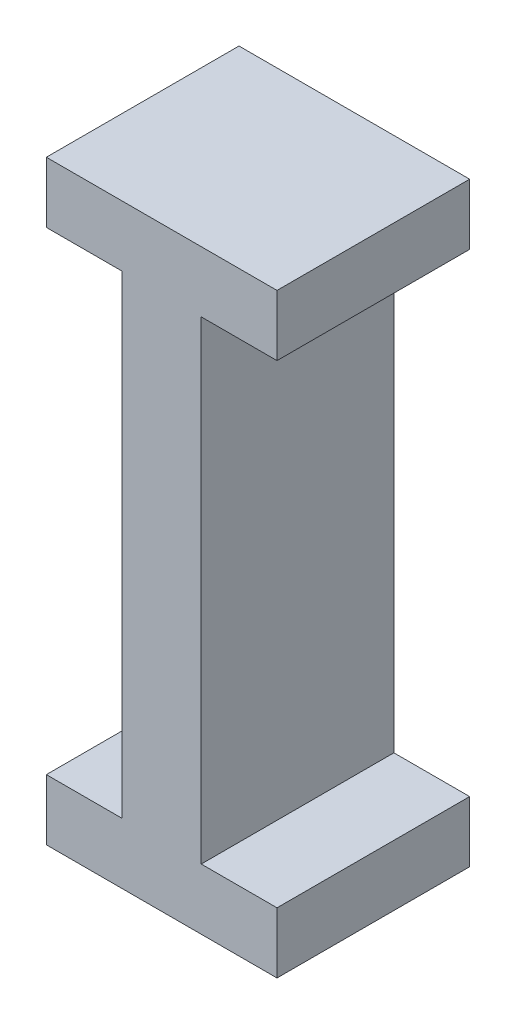
ISO-10303-21;
HEADER;
FILE_DESCRIPTION(('STEP AP214'),'2;1');
FILE_NAME('part.step','',(''),(''),'','','');
FILE_SCHEMA(('AUTOMOTIVE_DESIGN { 1 0 10303 214 1 1 1 1 }'));
ENDSEC;
DATA;
#1=APPLICATION_CONTEXT('core data for automotive mechanical design processes');
#2=APPLICATION_PROTOCOL_DEFINITION('international standard','automotive_design',2000,#1);
#3=PRODUCT_CONTEXT('',#1,'mechanical');
#4=PRODUCT('Part','Part','',(#3));
#5=PRODUCT_RELATED_PRODUCT_CATEGORY('part','',(#4));
#6=PRODUCT_DEFINITION_FORMATION('','',#4);
#7=PRODUCT_DEFINITION_CONTEXT('part definition',#1,'design');
#8=PRODUCT_DEFINITION('design','',#6,#7);
#9=PRODUCT_DEFINITION_SHAPE('','',#8);
#10=(LENGTH_UNIT() NAMED_UNIT(*) SI_UNIT(.MILLI.,.METRE.));
#11=(NAMED_UNIT(*) PLANE_ANGLE_UNIT() SI_UNIT($,.RADIAN.));
#12=(NAMED_UNIT(*) SI_UNIT($,.STERADIAN.) SOLID_ANGLE_UNIT());
#13=UNCERTAINTY_MEASURE_WITH_UNIT(LENGTH_MEASURE(1.E-05),#10,'distance_accuracy_value','');
#14=(GEOMETRIC_REPRESENTATION_CONTEXT(3) GLOBAL_UNCERTAINTY_ASSIGNED_CONTEXT((#13)) GLOBAL_UNIT_ASSIGNED_CONTEXT((#10,
#11,#12)) REPRESENTATION_CONTEXT('',''));
#15=CARTESIAN_POINT('',(0.,0.,0.));
#16=DIRECTION('',(0.,0.,1.));
#17=DIRECTION('',(1.,0.,0.));
#18=AXIS2_PLACEMENT_3D('',#15,#16,#17);
#19=CARTESIAN_POINT('',(-1.014865503557,-2.910145048967,0.));
#20=DIRECTION('',(-1.,0.,0.));
#21=DIRECTION('',(0.,-1.,0.));
#22=AXIS2_PLACEMENT_3D('',#19,#20,#21);
#23=PLANE('',#22);
#24=DIRECTION('',(0.,1.,0.));
#25=VECTOR('',#24,1.);
#26=CARTESIAN_POINT('',(-1.014865503557,-2.941706644287,0.));
#27=LINE('',#26,#25);
#28=CARTESIAN_POINT('',(-1.014865503557,-2.941706644287,0.));
#29=VERTEX_POINT('',#28);
#30=CARTESIAN_POINT('',(-1.014865503557,-2.910145048967,0.));
#31=VERTEX_POINT('',#30);
#32=EDGE_CURVE('E11',#29,#31,#27,.T.);
#33=ORIENTED_EDGE('',*,*,#32,.F.);
#34=DIRECTION('',(0.,0.,1.));
#35=VECTOR('',#34,1.);
#36=CARTESIAN_POINT('',(-1.014865503557,-2.941706644287,0.));
#37=LINE('',#36,#35);
#38=CARTESIAN_POINT('',(-1.014865503557,-2.941706644287,0.1));
#39=VERTEX_POINT('',#38);
#40=EDGE_CURVE('E24',#29,#39,#37,.T.);
#41=ORIENTED_EDGE('',*,*,#40,.T.);
#42=DIRECTION('',(0.,-1.,0.));
#43=VECTOR('',#42,1.);
#44=CARTESIAN_POINT('',(-1.014865503557,-2.941706644287,0.1));
#45=LINE('',#44,#43);
#46=CARTESIAN_POINT('',(-1.014865503557,-2.910145048967,0.1));
#47=VERTEX_POINT('',#46);
#48=EDGE_CURVE('E124',#47,#39,#45,.T.);
#49=ORIENTED_EDGE('',*,*,#48,.F.);
#50=DIRECTION('',(0.,0.,1.));
#51=VECTOR('',#50,1.);
#52=CARTESIAN_POINT('',(-1.014865503557,-2.910145048967,0.));
#53=LINE('',#52,#51);
#54=EDGE_CURVE('E197',#31,#47,#53,.T.);
#55=ORIENTED_EDGE('',*,*,#54,.F.);
#56=EDGE_LOOP('',(#33,#41,#49,#55));
#57=FACE_BOUND('',#56,.T.);
#58=ADVANCED_FACE('F17',(#57),#23,.T.);
#59=CARTESIAN_POINT('',(-0.975538753832608,-2.910145048967,0.));
#60=DIRECTION('',(0.,1.,0.));
#61=DIRECTION('',(-1.,0.,0.));
#62=AXIS2_PLACEMENT_3D('',#59,#60,#61);
#63=PLANE('',#62);
#64=DIRECTION('',(1.,0.,0.));
#65=VECTOR('',#64,1.);
#66=CARTESIAN_POINT('',(-1.014865503557,-2.910145048967,0.));
#67=LINE('',#66,#65);
#68=CARTESIAN_POINT('',(-0.975538753832608,-2.910145048967,0.));
#69=VERTEX_POINT('',#68);
#70=EDGE_CURVE('E195',#31,#69,#67,.T.);
#71=ORIENTED_EDGE('',*,*,#70,.F.);
#72=ORIENTED_EDGE('',*,*,#54,.T.);
#73=DIRECTION('',(-1.,0.,0.));
#74=VECTOR('',#73,1.);
#75=CARTESIAN_POINT('',(-1.014865503557,-2.910145048967,0.1));
#76=LINE('',#75,#74);
#77=CARTESIAN_POINT('',(-0.975538753832608,-2.910145048967,0.1));
#78=VERTEX_POINT('',#77);
#79=EDGE_CURVE('E193',#78,#47,#76,.T.);
#80=ORIENTED_EDGE('',*,*,#79,.F.);
#81=DIRECTION('',(0.,0.,1.));
#82=VECTOR('',#81,1.);
#83=CARTESIAN_POINT('',(-0.975538753832608,-2.910145048967,0.));
#84=LINE('',#83,#82);
#85=EDGE_CURVE('E190',#69,#78,#84,.T.);
#86=ORIENTED_EDGE('',*,*,#85,.F.);
#87=EDGE_LOOP('',(#71,#72,#80,#86));
#88=FACE_BOUND('',#87,.T.);
#89=ADVANCED_FACE('F235',(#88),#63,.T.);
#90=CARTESIAN_POINT('',(-0.975538753832608,-2.664164996554,0.));
#91=DIRECTION('',(-1.,0.,0.));
#92=DIRECTION('',(0.,-1.,0.));
#93=AXIS2_PLACEMENT_3D('',#90,#91,#92);
#94=PLANE('',#93);
#95=DIRECTION('',(0.,1.,0.));
#96=VECTOR('',#95,1.);
#97=CARTESIAN_POINT('',(-0.975538753832608,-2.910145048967,0.));
#98=LINE('',#97,#96);
#99=CARTESIAN_POINT('',(-0.975538753832608,-2.664164996554,0.));
#100=VERTEX_POINT('',#99);
#101=EDGE_CURVE('E188',#69,#100,#98,.T.);
#102=ORIENTED_EDGE('',*,*,#101,.F.);
#103=ORIENTED_EDGE('',*,*,#85,.T.);
#104=DIRECTION('',(0.,-1.,0.));
#105=VECTOR('',#104,1.);
#106=CARTESIAN_POINT('',(-0.975538753832608,-2.910145048967,0.1));
#107=LINE('',#106,#105);
#108=CARTESIAN_POINT('',(-0.975538753832608,-2.664164996554,0.1));
#109=VERTEX_POINT('',#108);
#110=EDGE_CURVE('E185',#109,#78,#107,.T.);
#111=ORIENTED_EDGE('',*,*,#110,.F.);
#112=DIRECTION('',(0.,0.,1.));
#113=VECTOR('',#112,1.);
#114=CARTESIAN_POINT('',(-0.975538753832608,-2.664164996554,0.));
#115=LINE('',#114,#113);
#116=EDGE_CURVE('E182',#100,#109,#115,.T.);
#117=ORIENTED_EDGE('',*,*,#116,.F.);
#118=EDGE_LOOP('',(#102,#103,#111,#117));
#119=FACE_BOUND('',#118,.T.);
#120=ADVANCED_FACE('F231',(#119),#94,.T.);
#121=CARTESIAN_POINT('',(-1.014865503557,-2.664164996554,0.));
#122=DIRECTION('',(0.,-1.,0.));
#123=DIRECTION('',(1.,0.,0.));
#124=AXIS2_PLACEMENT_3D('',#121,#122,#123);
#125=PLANE('',#124);
#126=DIRECTION('',(-1.,0.,0.));
#127=VECTOR('',#126,1.);
#128=CARTESIAN_POINT('',(-0.975538753832608,-2.664164996554,0.));
#129=LINE('',#128,#127);
#130=CARTESIAN_POINT('',(-1.014865503557,-2.664164996554,0.));
#131=VERTEX_POINT('',#130);
#132=EDGE_CURVE('E180',#100,#131,#129,.T.);
#133=ORIENTED_EDGE('',*,*,#132,.F.);
#134=ORIENTED_EDGE('',*,*,#116,.T.);
#135=DIRECTION('',(1.,0.,0.));
#136=VECTOR('',#135,1.);
#137=CARTESIAN_POINT('',(-0.975538753832608,-2.664164996554,0.1));
#138=LINE('',#137,#136);
#139=CARTESIAN_POINT('',(-1.014865503557,-2.664164996554,0.1));
#140=VERTEX_POINT('',#139);
#141=EDGE_CURVE('E177',#140,#109,#138,.T.);
#142=ORIENTED_EDGE('',*,*,#141,.F.);
#143=DIRECTION('',(0.,0.,1.));
#144=VECTOR('',#143,1.);
#145=CARTESIAN_POINT('',(-1.014865503557,-2.664164996554,0.));
#146=LINE('',#145,#144);
#147=EDGE_CURVE('E174',#131,#140,#146,.T.);
#148=ORIENTED_EDGE('',*,*,#147,.F.);
#149=EDGE_LOOP('',(#133,#134,#142,#148));
#150=FACE_BOUND('',#149,.T.);
#151=ADVANCED_FACE('F227',(#150),#125,.T.);
#152=CARTESIAN_POINT('',(-1.014865503557,-2.632603401234,0.));
#153=DIRECTION('',(-1.,0.,0.));
#154=DIRECTION('',(0.,-1.,0.));
#155=AXIS2_PLACEMENT_3D('',#152,#153,#154);
#156=PLANE('',#155);
#157=DIRECTION('',(0.,1.,0.));
#158=VECTOR('',#157,1.);
#159=CARTESIAN_POINT('',(-1.014865503557,-2.664164996554,0.));
#160=LINE('',#159,#158);
#161=CARTESIAN_POINT('',(-1.014865503557,-2.632603401234,0.));
#162=VERTEX_POINT('',#161);
#163=EDGE_CURVE('E172',#131,#162,#160,.T.);
#164=ORIENTED_EDGE('',*,*,#163,.F.);
#165=ORIENTED_EDGE('',*,*,#147,.T.);
#166=DIRECTION('',(0.,-1.,0.));
#167=VECTOR('',#166,1.);
#168=CARTESIAN_POINT('',(-1.014865503557,-2.664164996554,0.1));
#169=LINE('',#168,#167);
#170=CARTESIAN_POINT('',(-1.014865503557,-2.632603401234,0.1));
#171=VERTEX_POINT('',#170);
#172=EDGE_CURVE('E169',#171,#140,#169,.T.);
#173=ORIENTED_EDGE('',*,*,#172,.F.);
#174=DIRECTION('',(0.,0.,1.));
#175=VECTOR('',#174,1.);
#176=CARTESIAN_POINT('',(-1.014865503557,-2.632603401234,0.));
#177=LINE('',#176,#175);
#178=EDGE_CURVE('E166',#162,#171,#177,.T.);
#179=ORIENTED_EDGE('',*,*,#178,.F.);
#180=EDGE_LOOP('',(#164,#165,#173,#179));
#181=FACE_BOUND('',#180,.T.);
#182=ADVANCED_FACE('F223',(#181),#156,.T.);
#183=CARTESIAN_POINT('',(-0.895131832422559,-2.632603401234,0.));
#184=DIRECTION('',(0.,1.,0.));
#185=DIRECTION('',(-1.,0.,0.));
#186=AXIS2_PLACEMENT_3D('',#183,#184,#185);
#187=PLANE('',#186);
#188=DIRECTION('',(1.,0.,0.));
#189=VECTOR('',#188,1.);
#190=CARTESIAN_POINT('',(-1.014865503557,-2.632603401234,0.));
#191=LINE('',#190,#189);
#192=CARTESIAN_POINT('',(-0.895131832422559,-2.632603401234,0.));
#193=VERTEX_POINT('',#192);
#194=EDGE_CURVE('E164',#162,#193,#191,.T.);
#195=ORIENTED_EDGE('',*,*,#194,.F.);
#196=ORIENTED_EDGE('',*,*,#178,.T.);
#197=DIRECTION('',(-1.,0.,0.));
#198=VECTOR('',#197,1.);
#199=CARTESIAN_POINT('',(-1.014865503557,-2.632603401234,0.1));
#200=LINE('',#199,#198);
#201=CARTESIAN_POINT('',(-0.895131832422559,-2.632603401234,0.1));
#202=VERTEX_POINT('',#201);
#203=EDGE_CURVE('E161',#202,#171,#200,.T.);
#204=ORIENTED_EDGE('',*,*,#203,.F.);
#205=DIRECTION('',(0.,0.,1.));
#206=VECTOR('',#205,1.);
#207=CARTESIAN_POINT('',(-0.895131832422559,-2.632603401234,0.));
#208=LINE('',#207,#206);
#209=EDGE_CURVE('E158',#193,#202,#208,.T.);
#210=ORIENTED_EDGE('',*,*,#209,.F.);
#211=EDGE_LOOP('',(#195,#196,#204,#210));
#212=FACE_BOUND('',#211,.T.);
#213=ADVANCED_FACE('F219',(#212),#187,.T.);
#214=CARTESIAN_POINT('',(-0.895131832422559,-2.664164996554,0.));
#215=DIRECTION('',(1.,0.,0.));
#216=DIRECTION('',(0.,1.,0.));
#217=AXIS2_PLACEMENT_3D('',#214,#215,#216);
#218=PLANE('',#217);
#219=DIRECTION('',(0.,-1.,0.));
#220=VECTOR('',#219,1.);
#221=CARTESIAN_POINT('',(-0.895131832422559,-2.632603401234,0.));
#222=LINE('',#221,#220);
#223=CARTESIAN_POINT('',(-0.895131832422559,-2.664164996554,0.));
#224=VERTEX_POINT('',#223);
#225=EDGE_CURVE('E156',#193,#224,#222,.T.);
#226=ORIENTED_EDGE('',*,*,#225,.F.);
#227=ORIENTED_EDGE('',*,*,#209,.T.);
#228=DIRECTION('',(0.,1.,0.));
#229=VECTOR('',#228,1.);
#230=CARTESIAN_POINT('',(-0.895131832422559,-2.632603401234,0.1));
#231=LINE('',#230,#229);
#232=CARTESIAN_POINT('',(-0.895131832422559,-2.664164996554,0.1));
#233=VERTEX_POINT('',#232);
#234=EDGE_CURVE('E153',#233,#202,#231,.T.);
#235=ORIENTED_EDGE('',*,*,#234,.F.);
#236=DIRECTION('',(0.,0.,1.));
#237=VECTOR('',#236,1.);
#238=CARTESIAN_POINT('',(-0.895131832422559,-2.664164996554,0.));
#239=LINE('',#238,#237);
#240=EDGE_CURVE('E150',#224,#233,#239,.T.);
#241=ORIENTED_EDGE('',*,*,#240,.F.);
#242=EDGE_LOOP('',(#226,#227,#235,#241));
#243=FACE_BOUND('',#242,.T.);
#244=ADVANCED_FACE('F215',(#243),#218,.T.);
#245=CARTESIAN_POINT('',(-0.934458582146477,-2.664164996554,0.));
#246=DIRECTION('',(0.,-1.,0.));
#247=DIRECTION('',(1.,0.,0.));
#248=AXIS2_PLACEMENT_3D('',#245,#246,#247);
#249=PLANE('',#248);
#250=DIRECTION('',(-1.,0.,0.));
#251=VECTOR('',#250,1.);
#252=CARTESIAN_POINT('',(-0.895131832422559,-2.664164996554,0.));
#253=LINE('',#252,#251);
#254=CARTESIAN_POINT('',(-0.934458582146477,-2.664164996554,0.));
#255=VERTEX_POINT('',#254);
#256=EDGE_CURVE('E148',#224,#255,#253,.T.);
#257=ORIENTED_EDGE('',*,*,#256,.F.);
#258=ORIENTED_EDGE('',*,*,#240,.T.);
#259=DIRECTION('',(1.,0.,0.));
#260=VECTOR('',#259,1.);
#261=CARTESIAN_POINT('',(-0.895131832422559,-2.664164996554,0.1));
#262=LINE('',#261,#260);
#263=CARTESIAN_POINT('',(-0.934458582146477,-2.664164996554,0.1));
#264=VERTEX_POINT('',#263);
#265=EDGE_CURVE('E145',#264,#233,#262,.T.);
#266=ORIENTED_EDGE('',*,*,#265,.F.);
#267=DIRECTION('',(0.,0.,1.));
#268=VECTOR('',#267,1.);
#269=CARTESIAN_POINT('',(-0.934458582146477,-2.664164996554,0.));
#270=LINE('',#269,#268);
#271=EDGE_CURVE('E142',#255,#264,#270,.T.);
#272=ORIENTED_EDGE('',*,*,#271,.F.);
#273=EDGE_LOOP('',(#257,#258,#266,#272));
#274=FACE_BOUND('',#273,.T.);
#275=ADVANCED_FACE('F211',(#274),#249,.T.);
#276=CARTESIAN_POINT('',(-0.934458582146477,-2.910145048967,0.));
#277=DIRECTION('',(1.,0.,0.));
#278=DIRECTION('',(0.,1.,0.));
#279=AXIS2_PLACEMENT_3D('',#276,#277,#278);
#280=PLANE('',#279);
#281=DIRECTION('',(0.,-1.,0.));
#282=VECTOR('',#281,1.);
#283=CARTESIAN_POINT('',(-0.934458582146477,-2.664164996554,0.));
#284=LINE('',#283,#282);
#285=CARTESIAN_POINT('',(-0.934458582146477,-2.910145048967,0.));
#286=VERTEX_POINT('',#285);
#287=EDGE_CURVE('E140',#255,#286,#284,.T.);
#288=ORIENTED_EDGE('',*,*,#287,.F.);
#289=ORIENTED_EDGE('',*,*,#271,.T.);
#290=DIRECTION('',(0.,1.,0.));
#291=VECTOR('',#290,1.);
#292=CARTESIAN_POINT('',(-0.934458582146477,-2.664164996554,0.1));
#293=LINE('',#292,#291);
#294=CARTESIAN_POINT('',(-0.934458582146477,-2.910145048967,0.1));
#295=VERTEX_POINT('',#294);
#296=EDGE_CURVE('E137',#295,#264,#293,.T.);
#297=ORIENTED_EDGE('',*,*,#296,.F.);
#298=DIRECTION('',(0.,0.,1.));
#299=VECTOR('',#298,1.);
#300=CARTESIAN_POINT('',(-0.934458582146477,-2.910145048967,0.));
#301=LINE('',#300,#299);
#302=EDGE_CURVE('E134',#286,#295,#301,.T.);
#303=ORIENTED_EDGE('',*,*,#302,.F.);
#304=EDGE_LOOP('',(#288,#289,#297,#303));
#305=FACE_BOUND('',#304,.T.);
#306=ADVANCED_FACE('F207',(#305),#280,.T.);
#307=CARTESIAN_POINT('',(-0.895131832422559,-2.910145048967,0.));
#308=DIRECTION('',(0.,1.,0.));
#309=DIRECTION('',(-1.,0.,0.));
#310=AXIS2_PLACEMENT_3D('',#307,#308,#309);
#311=PLANE('',#310);
#312=DIRECTION('',(1.,0.,0.));
#313=VECTOR('',#312,1.);
#314=CARTESIAN_POINT('',(-0.934458582146477,-2.910145048967,0.));
#315=LINE('',#314,#313);
#316=CARTESIAN_POINT('',(-0.895131832422559,-2.910145048967,0.));
#317=VERTEX_POINT('',#316);
#318=EDGE_CURVE('E132',#286,#317,#315,.T.);
#319=ORIENTED_EDGE('',*,*,#318,.F.);
#320=ORIENTED_EDGE('',*,*,#302,.T.);
#321=DIRECTION('',(-1.,0.,0.));
#322=VECTOR('',#321,1.);
#323=CARTESIAN_POINT('',(-0.934458582146477,-2.910145048967,0.1));
#324=LINE('',#323,#322);
#325=CARTESIAN_POINT('',(-0.895131832422559,-2.910145048967,0.1));
#326=VERTEX_POINT('',#325);
#327=EDGE_CURVE('E130',#326,#295,#324,.T.);
#328=ORIENTED_EDGE('',*,*,#327,.F.);
#329=DIRECTION('',(0.,0.,1.));
#330=VECTOR('',#329,1.);
#331=CARTESIAN_POINT('',(-0.895131832422559,-2.910145048967,0.));
#332=LINE('',#331,#330);
#333=EDGE_CURVE('E109',#317,#326,#332,.T.);
#334=ORIENTED_EDGE('',*,*,#333,.F.);
#335=EDGE_LOOP('',(#319,#320,#328,#334));
#336=FACE_BOUND('',#335,.T.);
#337=ADVANCED_FACE('F205',(#336),#311,.T.);
#338=CARTESIAN_POINT('',(-0.895131832422559,-2.941706644287,0.));
#339=DIRECTION('',(1.,0.,0.));
#340=DIRECTION('',(0.,1.,0.));
#341=AXIS2_PLACEMENT_3D('',#338,#339,#340);
#342=PLANE('',#341);
#343=DIRECTION('',(0.,-1.,0.));
#344=VECTOR('',#343,1.);
#345=CARTESIAN_POINT('',(-0.895131832422559,-2.910145048967,0.));
#346=LINE('',#345,#344);
#347=CARTESIAN_POINT('',(-0.895131832422559,-2.941706644287,0.));
#348=VERTEX_POINT('',#347);
#349=EDGE_CURVE('E113',#317,#348,#346,.T.);
#350=ORIENTED_EDGE('',*,*,#349,.F.);
#351=ORIENTED_EDGE('',*,*,#333,.T.);
#352=DIRECTION('',(0.,1.,0.));
#353=VECTOR('',#352,1.);
#354=CARTESIAN_POINT('',(-0.895131832422559,-2.910145048967,0.1));
#355=LINE('',#354,#353);
#356=CARTESIAN_POINT('',(-0.895131832422559,-2.941706644287,0.1));
#357=VERTEX_POINT('',#356);
#358=EDGE_CURVE('E102',#357,#326,#355,.T.);
#359=ORIENTED_EDGE('',*,*,#358,.F.);
#360=DIRECTION('',(0.,0.,1.));
#361=VECTOR('',#360,1.);
#362=CARTESIAN_POINT('',(-0.895131832422559,-2.941706644287,0.));
#363=LINE('',#362,#361);
#364=EDGE_CURVE('E106',#348,#357,#363,.T.);
#365=ORIENTED_EDGE('',*,*,#364,.F.);
#366=EDGE_LOOP('',(#350,#351,#359,#365));
#367=FACE_BOUND('',#366,.T.);
#368=ADVANCED_FACE('F105',(#367),#342,.T.);
#369=CARTESIAN_POINT('',(-1.014865503557,-2.941706644287,0.));
#370=DIRECTION('',(0.,-1.,0.));
#371=DIRECTION('',(1.,0.,0.));
#372=AXIS2_PLACEMENT_3D('',#369,#370,#371);
#373=PLANE('',#372);
#374=DIRECTION('',(-1.,0.,0.));
#375=VECTOR('',#374,1.);
#376=CARTESIAN_POINT('',(-0.895131832422559,-2.941706644287,0.));
#377=LINE('',#376,#375);
#378=EDGE_CURVE('E119',#348,#29,#377,.T.);
#379=ORIENTED_EDGE('',*,*,#378,.F.);
#380=ORIENTED_EDGE('',*,*,#364,.T.);
#381=DIRECTION('',(1.,0.,0.));
#382=VECTOR('',#381,1.);
#383=CARTESIAN_POINT('',(-0.895131832422559,-2.941706644287,0.1));
#384=LINE('',#383,#382);
#385=EDGE_CURVE('E118',#39,#357,#384,.T.);
#386=ORIENTED_EDGE('',*,*,#385,.F.);
#387=ORIENTED_EDGE('',*,*,#40,.F.);
#388=EDGE_LOOP('',(#379,#380,#386,#387));
#389=FACE_BOUND('',#388,.T.);
#390=ADVANCED_FACE('F117',(#389),#373,.T.);
#391=CARTESIAN_POINT('',(-0.954998667989543,-2.787155022761,0.));
#392=DIRECTION('',(0.,0.,1.));
#393=DIRECTION('',(1.,0.,0.));
#394=AXIS2_PLACEMENT_3D('',#391,#392,#393);
#395=PLANE('',#394);
#396=ORIENTED_EDGE('',*,*,#378,.T.);
#397=ORIENTED_EDGE('',*,*,#32,.T.);
#398=ORIENTED_EDGE('',*,*,#70,.T.);
#399=ORIENTED_EDGE('',*,*,#101,.T.);
#400=ORIENTED_EDGE('',*,*,#132,.T.);
#401=ORIENTED_EDGE('',*,*,#163,.T.);
#402=ORIENTED_EDGE('',*,*,#194,.T.);
#403=ORIENTED_EDGE('',*,*,#225,.T.);
#404=ORIENTED_EDGE('',*,*,#256,.T.);
#405=ORIENTED_EDGE('',*,*,#287,.T.);
#406=ORIENTED_EDGE('',*,*,#318,.T.);
#407=ORIENTED_EDGE('',*,*,#349,.T.);
#408=EDGE_LOOP('',(#396,#397,#398,#399,#400,#401,#402,#403,#404,#405,#406,#407));
#409=FACE_BOUND('',#408,.T.);
#410=ADVANCED_FACE('F200',(#409),#395,.F.);
#411=CARTESIAN_POINT('',(-0.954998667989543,-2.787155022761,0.1));
#412=DIRECTION('',(0.,0.,1.));
#413=DIRECTION('',(1.,0.,0.));
#414=AXIS2_PLACEMENT_3D('',#411,#412,#413);
#415=PLANE('',#414);
#416=ORIENTED_EDGE('',*,*,#385,.T.);
#417=ORIENTED_EDGE('',*,*,#358,.T.);
#418=ORIENTED_EDGE('',*,*,#327,.T.);
#419=ORIENTED_EDGE('',*,*,#296,.T.);
#420=ORIENTED_EDGE('',*,*,#265,.T.);
#421=ORIENTED_EDGE('',*,*,#234,.T.);
#422=ORIENTED_EDGE('',*,*,#203,.T.);
#423=ORIENTED_EDGE('',*,*,#172,.T.);
#424=ORIENTED_EDGE('',*,*,#141,.T.);
#425=ORIENTED_EDGE('',*,*,#110,.T.);
#426=ORIENTED_EDGE('',*,*,#79,.T.);
#427=ORIENTED_EDGE('',*,*,#48,.T.);
#428=EDGE_LOOP('',(#416,#417,#418,#419,#420,#421,#422,#423,#424,#425,#426,#427));
#429=FACE_BOUND('',#428,.T.);
#430=ADVANCED_FACE('F122',(#429),#415,.T.);
#431=CLOSED_SHELL('',(#58,#89,#120,#151,#182,#213,#244,#275,#306,#337,#368,#390,#410,#430));
#432=MANIFOLD_SOLID_BREP('B1',#431);
#433=ADVANCED_BREP_SHAPE_REPRESENTATION('',(#18,#432),#14);
#434=SHAPE_DEFINITION_REPRESENTATION(#9,#433);
ENDSEC;
END-ISO-10303-21;
